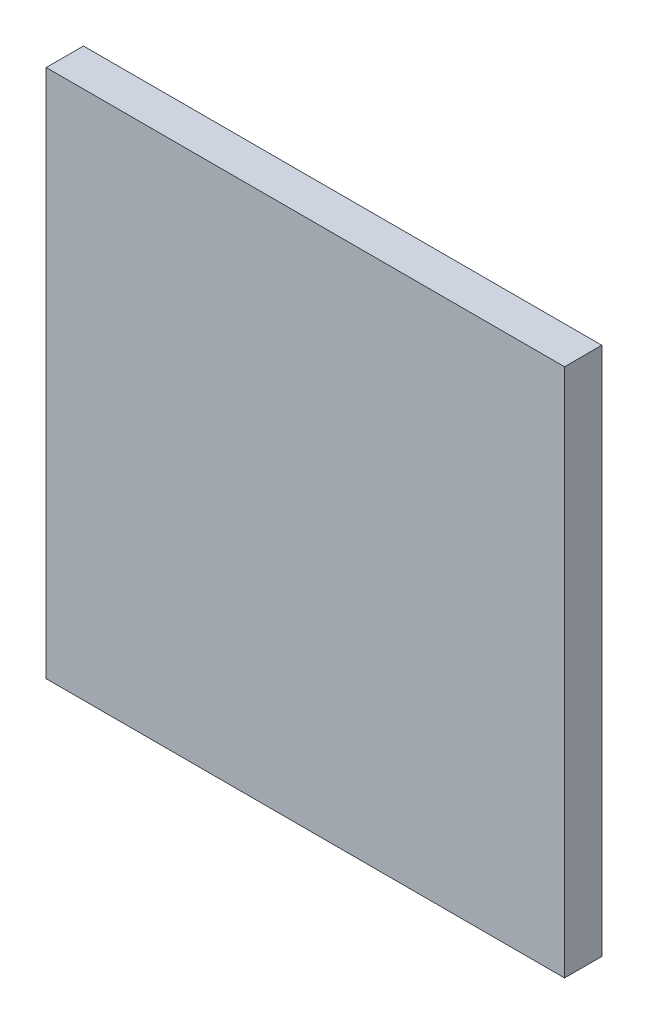
ISO-10303-21;
HEADER;
FILE_DESCRIPTION(('STEP AP214'),'2;1');
FILE_NAME('part.step','',(''),(''),'','','');
FILE_SCHEMA(('AUTOMOTIVE_DESIGN { 1 0 10303 214 1 1 1 1 }'));
ENDSEC;
DATA;
#1=APPLICATION_CONTEXT('core data for automotive mechanical design processes');
#2=APPLICATION_PROTOCOL_DEFINITION('international standard','automotive_design',2000,#1);
#3=PRODUCT_CONTEXT('',#1,'mechanical');
#4=PRODUCT('Part','Part','',(#3));
#5=PRODUCT_RELATED_PRODUCT_CATEGORY('part','',(#4));
#6=PRODUCT_DEFINITION_FORMATION('','',#4);
#7=PRODUCT_DEFINITION_CONTEXT('part definition',#1,'design');
#8=PRODUCT_DEFINITION('design','',#6,#7);
#9=PRODUCT_DEFINITION_SHAPE('','',#8);
#10=(LENGTH_UNIT() NAMED_UNIT(*) SI_UNIT(.MILLI.,.METRE.));
#11=(NAMED_UNIT(*) PLANE_ANGLE_UNIT() SI_UNIT($,.RADIAN.));
#12=(NAMED_UNIT(*) SI_UNIT($,.STERADIAN.) SOLID_ANGLE_UNIT());
#13=UNCERTAINTY_MEASURE_WITH_UNIT(LENGTH_MEASURE(1.E-05),#10,'distance_accuracy_value','');
#14=(GEOMETRIC_REPRESENTATION_CONTEXT(3) GLOBAL_UNCERTAINTY_ASSIGNED_CONTEXT((#13)) GLOBAL_UNIT_ASSIGNED_CONTEXT((#10,
#11,#12)) REPRESENTATION_CONTEXT('',''));
#15=CARTESIAN_POINT('',(0.,0.,0.));
#16=DIRECTION('',(0.,0.,1.));
#17=DIRECTION('',(1.,0.,0.));
#18=AXIS2_PLACEMENT_3D('',#15,#16,#17);
#19=CARTESIAN_POINT('',(-8.,-7.25,1.15));
#20=DIRECTION('',(1.,0.,0.));
#21=DIRECTION('',(0.,0.,-1.));
#22=AXIS2_PLACEMENT_3D('',#19,#20,#21);
#23=PLANE('',#22);
#24=DIRECTION('',(0.,-1.,0.));
#25=VECTOR('',#24,1.);
#26=CARTESIAN_POINT('',(-8.,-7.25,0.));
#27=LINE('',#26,#25);
#28=CARTESIAN_POINT('',(-8.,9.09,0.));
#29=VERTEX_POINT('',#28);
#30=CARTESIAN_POINT('',(-8.,-7.25,0.));
#31=VERTEX_POINT('',#30);
#32=EDGE_CURVE('E96',#29,#31,#27,.T.);
#33=ORIENTED_EDGE('',*,*,#32,.T.);
#34=DIRECTION('',(0.,0.,-1.));
#35=VECTOR('',#34,1.);
#36=CARTESIAN_POINT('',(-8.,-7.25,1.15));
#37=LINE('',#36,#35);
#38=CARTESIAN_POINT('',(-8.,-7.25,1.15));
#39=VERTEX_POINT('',#38);
#40=EDGE_CURVE('E11',#39,#31,#37,.T.);
#41=ORIENTED_EDGE('',*,*,#40,.F.);
#42=DIRECTION('',(0.,-1.,0.));
#43=VECTOR('',#42,1.);
#44=CARTESIAN_POINT('',(-8.,-7.25,1.15));
#45=LINE('',#44,#43);
#46=CARTESIAN_POINT('',(-8.,9.09,1.15));
#47=VERTEX_POINT('',#46);
#48=EDGE_CURVE('E84',#47,#39,#45,.T.);
#49=ORIENTED_EDGE('',*,*,#48,.F.);
#50=DIRECTION('',(0.,0.,-1.));
#51=VECTOR('',#50,1.);
#52=CARTESIAN_POINT('',(-8.,9.09,1.15));
#53=LINE('',#52,#51);
#54=EDGE_CURVE('E92',#47,#29,#53,.T.);
#55=ORIENTED_EDGE('',*,*,#54,.T.);
#56=EDGE_LOOP('',(#33,#41,#49,#55));
#57=FACE_BOUND('',#56,.T.);
#58=ADVANCED_FACE('F33',(#57),#23,.F.);
#59=CARTESIAN_POINT('',(8.,-7.25,1.15));
#60=DIRECTION('',(0.,1.,0.));
#61=DIRECTION('',(0.,0.,1.));
#62=AXIS2_PLACEMENT_3D('',#59,#60,#61);
#63=PLANE('',#62);
#64=DIRECTION('',(1.,0.,0.));
#65=VECTOR('',#64,1.);
#66=CARTESIAN_POINT('',(8.,-7.25,0.));
#67=LINE('',#66,#65);
#68=CARTESIAN_POINT('',(8.,-7.25,0.));
#69=VERTEX_POINT('',#68);
#70=EDGE_CURVE('E88',#31,#69,#67,.T.);
#71=ORIENTED_EDGE('',*,*,#70,.T.);
#72=DIRECTION('',(0.,0.,-1.));
#73=VECTOR('',#72,1.);
#74=CARTESIAN_POINT('',(8.,-7.25,1.15));
#75=LINE('',#74,#73);
#76=CARTESIAN_POINT('',(8.,-7.25,1.15));
#77=VERTEX_POINT('',#76);
#78=EDGE_CURVE('E41',#77,#69,#75,.T.);
#79=ORIENTED_EDGE('',*,*,#78,.F.);
#80=DIRECTION('',(1.,0.,0.));
#81=VECTOR('',#80,1.);
#82=CARTESIAN_POINT('',(8.,-7.25,1.15));
#83=LINE('',#82,#81);
#84=EDGE_CURVE('E79',#39,#77,#83,.T.);
#85=ORIENTED_EDGE('',*,*,#84,.F.);
#86=ORIENTED_EDGE('',*,*,#40,.T.);
#87=EDGE_LOOP('',(#71,#79,#85,#86));
#88=FACE_BOUND('',#87,.T.);
#89=ADVANCED_FACE('F87',(#88),#63,.F.);
#90=CARTESIAN_POINT('',(8.,9.09,1.15));
#91=DIRECTION('',(-1.,0.,0.));
#92=DIRECTION('',(0.,0.,1.));
#93=AXIS2_PLACEMENT_3D('',#90,#91,#92);
#94=PLANE('',#93);
#95=DIRECTION('',(0.,1.,0.));
#96=VECTOR('',#95,1.);
#97=CARTESIAN_POINT('',(8.,9.09,0.));
#98=LINE('',#97,#96);
#99=CARTESIAN_POINT('',(8.,9.09,0.));
#100=VERTEX_POINT('',#99);
#101=EDGE_CURVE('E66',#69,#100,#98,.T.);
#102=ORIENTED_EDGE('',*,*,#101,.T.);
#103=DIRECTION('',(0.,0.,-1.));
#104=VECTOR('',#103,1.);
#105=CARTESIAN_POINT('',(8.,9.09,1.15));
#106=LINE('',#105,#104);
#107=CARTESIAN_POINT('',(8.,9.09,1.15));
#108=VERTEX_POINT('',#107);
#109=EDGE_CURVE('E89',#108,#100,#106,.T.);
#110=ORIENTED_EDGE('',*,*,#109,.F.);
#111=DIRECTION('',(0.,1.,0.));
#112=VECTOR('',#111,1.);
#113=CARTESIAN_POINT('',(8.,9.09,1.15));
#114=LINE('',#113,#112);
#115=EDGE_CURVE('E82',#77,#108,#114,.T.);
#116=ORIENTED_EDGE('',*,*,#115,.F.);
#117=ORIENTED_EDGE('',*,*,#78,.T.);
#118=EDGE_LOOP('',(#102,#110,#116,#117));
#119=FACE_BOUND('',#118,.T.);
#120=ADVANCED_FACE('F90',(#119),#94,.F.);
#121=CARTESIAN_POINT('',(-8.,9.09,1.15));
#122=DIRECTION('',(0.,-1.,0.));
#123=DIRECTION('',(0.,0.,-1.));
#124=AXIS2_PLACEMENT_3D('',#121,#122,#123);
#125=PLANE('',#124);
#126=DIRECTION('',(-1.,0.,0.));
#127=VECTOR('',#126,1.);
#128=CARTESIAN_POINT('',(-8.,9.09,0.));
#129=LINE('',#128,#127);
#130=EDGE_CURVE('E72',#100,#29,#129,.T.);
#131=ORIENTED_EDGE('',*,*,#130,.T.);
#132=ORIENTED_EDGE('',*,*,#54,.F.);
#133=DIRECTION('',(-1.,0.,0.));
#134=VECTOR('',#133,1.);
#135=CARTESIAN_POINT('',(-8.,9.09,1.15));
#136=LINE('',#135,#134);
#137=EDGE_CURVE('E49',#108,#47,#136,.T.);
#138=ORIENTED_EDGE('',*,*,#137,.F.);
#139=ORIENTED_EDGE('',*,*,#109,.T.);
#140=EDGE_LOOP('',(#131,#132,#138,#139));
#141=FACE_BOUND('',#140,.T.);
#142=ADVANCED_FACE('F103',(#141),#125,.F.);
#143=CARTESIAN_POINT('',(0.,0.,1.15));
#144=DIRECTION('',(0.,0.,-1.));
#145=DIRECTION('',(-1.,0.,0.));
#146=AXIS2_PLACEMENT_3D('',#143,#144,#145);
#147=PLANE('',#146);
#148=ORIENTED_EDGE('',*,*,#48,.T.);
#149=ORIENTED_EDGE('',*,*,#84,.T.);
#150=ORIENTED_EDGE('',*,*,#115,.T.);
#151=ORIENTED_EDGE('',*,*,#137,.T.);
#152=EDGE_LOOP('',(#148,#149,#150,#151));
#153=FACE_BOUND('',#152,.T.);
#154=ADVANCED_FACE('F80',(#153),#147,.F.);
#155=CARTESIAN_POINT('',(0.,0.,0.));
#156=DIRECTION('',(0.,0.,-1.));
#157=DIRECTION('',(-1.,0.,0.));
#158=AXIS2_PLACEMENT_3D('',#155,#156,#157);
#159=PLANE('',#158);
#160=ORIENTED_EDGE('',*,*,#32,.F.);
#161=ORIENTED_EDGE('',*,*,#130,.F.);
#162=ORIENTED_EDGE('',*,*,#101,.F.);
#163=ORIENTED_EDGE('',*,*,#70,.F.);
#164=EDGE_LOOP('',(#160,#161,#162,#163));
#165=FACE_BOUND('',#164,.T.);
#166=ADVANCED_FACE('F106',(#165),#159,.T.);
#167=CLOSED_SHELL('',(#58,#89,#120,#142,#154,#166));
#168=MANIFOLD_SOLID_BREP('B2',#167);
#169=ADVANCED_BREP_SHAPE_REPRESENTATION('',(#18,#168),#14);
#170=SHAPE_DEFINITION_REPRESENTATION(#9,#169);
ENDSEC;
END-ISO-10303-21;
